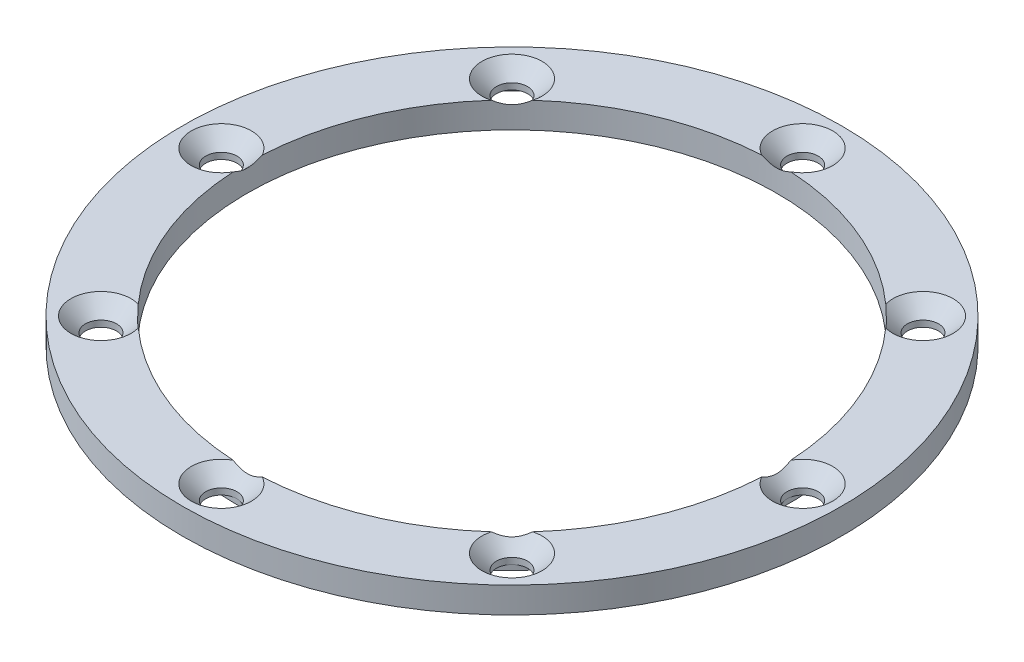
ISO-10303-21;
HEADER;
FILE_DESCRIPTION(('STEP AP214'),'2;1');
FILE_NAME('part.step','',(''),(''),'','','');
FILE_SCHEMA(('AUTOMOTIVE_DESIGN { 1 0 10303 214 1 1 1 1 }'));
ENDSEC;
DATA;
#1=APPLICATION_CONTEXT('core data for automotive mechanical design processes');
#2=APPLICATION_PROTOCOL_DEFINITION('international standard','automotive_design',2000,#1);
#3=PRODUCT_CONTEXT('',#1,'mechanical');
#4=PRODUCT('Part','Part','',(#3));
#5=PRODUCT_RELATED_PRODUCT_CATEGORY('part','',(#4));
#6=PRODUCT_DEFINITION_FORMATION('','',#4);
#7=PRODUCT_DEFINITION_CONTEXT('part definition',#1,'design');
#8=PRODUCT_DEFINITION('design','',#6,#7);
#9=PRODUCT_DEFINITION_SHAPE('','',#8);
#10=(LENGTH_UNIT() NAMED_UNIT(*) SI_UNIT(.MILLI.,.METRE.));
#11=(NAMED_UNIT(*) PLANE_ANGLE_UNIT() SI_UNIT($,.RADIAN.));
#12=(NAMED_UNIT(*) SI_UNIT($,.STERADIAN.) SOLID_ANGLE_UNIT());
#13=UNCERTAINTY_MEASURE_WITH_UNIT(LENGTH_MEASURE(1.E-05),#10,'distance_accuracy_value','');
#14=(GEOMETRIC_REPRESENTATION_CONTEXT(3) GLOBAL_UNCERTAINTY_ASSIGNED_CONTEXT((#13)) GLOBAL_UNIT_ASSIGNED_CONTEXT((#10,
#11,#12)) REPRESENTATION_CONTEXT('',''));
#15=CARTESIAN_POINT('',(0.,0.,0.));
#16=DIRECTION('',(0.,0.,1.));
#17=DIRECTION('',(1.,0.,0.));
#18=AXIS2_PLACEMENT_3D('',#15,#16,#17);
#19=CARTESIAN_POINT('',(0.,0.,0.));
#20=DIRECTION('',(0.,1.,0.));
#21=DIRECTION('',(0.,0.,1.));
#22=AXIS2_PLACEMENT_3D('',#19,#20,#21);
#23=PLANE('',#22);
#24=CARTESIAN_POINT('',(0.,0.,0.));
#25=DIRECTION('',(0.,1.,0.));
#26=DIRECTION('',(0.,0.,1.));
#27=AXIS2_PLACEMENT_3D('',#24,#25,#26);
#28=CIRCLE('',#27,25.5);
#29=CARTESIAN_POINT('',(0.,0.,25.5));
#30=VERTEX_POINT('',#29);
#31=EDGE_CURVE('E153',#30,#30,#28,.T.);
#32=ORIENTED_EDGE('',*,*,#31,.T.);
#33=EDGE_LOOP('',(#32));
#34=FACE_BOUND('',#33,.T.);
#35=CARTESIAN_POINT('',(0.,0.,0.));
#36=DIRECTION('',(0.,-1.,0.));
#37=DIRECTION('',(0.,0.,-1.));
#38=AXIS2_PLACEMENT_3D('',#35,#36,#37);
#39=CIRCLE('',#38,26.5);
#40=CARTESIAN_POINT('',(0.,0.,-26.5));
#41=VERTEX_POINT('',#40);
#42=EDGE_CURVE('E271',#41,#41,#39,.T.);
#43=ORIENTED_EDGE('',*,*,#42,.T.);
#44=EDGE_LOOP('',(#43));
#45=FACE_BOUND('',#44,.T.);
#46=ADVANCED_FACE('F34',(#34,#45),#23,.F.);
#47=CARTESIAN_POINT('',(19.7989898732233,10.,-19.7989898732233));
#48=DIRECTION('',(0.,-1.,0.));
#49=DIRECTION('',(0.,0.,-1.));
#50=AXIS2_PLACEMENT_3D('',#47,#48,#49);
#51=CYLINDRICAL_SURFACE('',#50,1.5);
#52=CARTESIAN_POINT('',(19.7989898732233,1.1,-19.7989898732233));
#53=DIRECTION('',(0.,1.,0.));
#54=DIRECTION('',(0.,0.,1.));
#55=AXIS2_PLACEMENT_3D('',#52,#53,#54);
#56=CIRCLE('',#55,1.5);
#57=CARTESIAN_POINT('',(19.7989898732233,1.1,-18.2989898732233));
#58=VERTEX_POINT('',#57);
#59=EDGE_CURVE('E239',#58,#58,#56,.T.);
#60=ORIENTED_EDGE('',*,*,#59,.T.);
#61=EDGE_LOOP('',(#60));
#62=FACE_BOUND('',#61,.T.);
#63=CARTESIAN_POINT('',(19.7989898732233,0.5,-19.7989898732233));
#64=DIRECTION('',(0.,-1.,0.));
#65=DIRECTION('',(0.,0.,-1.));
#66=AXIS2_PLACEMENT_3D('',#63,#64,#65);
#67=CIRCLE('',#66,1.5);
#68=CARTESIAN_POINT('',(18.7383297014435,0.5,-18.7383297014435));
#69=VERTEX_POINT('',#68);
#70=EDGE_CURVE('E151',#69,#69,#67,.F.);
#71=ORIENTED_EDGE('',*,*,#70,.F.);
#72=EDGE_LOOP('',(#71));
#73=FACE_BOUND('',#72,.T.);
#74=ADVANCED_FACE('F227',(#62,#73),#51,.F.);
#75=CARTESIAN_POINT('',(28.,10.,0.));
#76=DIRECTION('',(0.,-1.,0.));
#77=DIRECTION('',(0.,0.,-1.));
#78=AXIS2_PLACEMENT_3D('',#75,#76,#77);
#79=CYLINDRICAL_SURFACE('',#78,1.5);
#80=CARTESIAN_POINT('',(28.,1.1,0.));
#81=DIRECTION('',(0.,1.,0.));
#82=DIRECTION('',(0.,0.,1.));
#83=AXIS2_PLACEMENT_3D('',#80,#81,#82);
#84=CIRCLE('',#83,1.5);
#85=CARTESIAN_POINT('',(28.,1.1,1.5));
#86=VERTEX_POINT('',#85);
#87=EDGE_CURVE('E302',#86,#86,#84,.T.);
#88=ORIENTED_EDGE('',*,*,#87,.T.);
#89=EDGE_LOOP('',(#88));
#90=FACE_BOUND('',#89,.T.);
#91=CARTESIAN_POINT('',(28.,0.5,0.));
#92=DIRECTION('',(0.,-1.,0.));
#93=DIRECTION('',(0.,0.,-1.));
#94=AXIS2_PLACEMENT_3D('',#91,#92,#93);
#95=CIRCLE('',#94,1.5);
#96=CARTESIAN_POINT('',(26.5,0.5,0.));
#97=VERTEX_POINT('',#96);
#98=EDGE_CURVE('E244',#97,#97,#95,.F.);
#99=ORIENTED_EDGE('',*,*,#98,.F.);
#100=EDGE_LOOP('',(#99));
#101=FACE_BOUND('',#100,.T.);
#102=ADVANCED_FACE('F224',(#90,#101),#79,.F.);
#103=CARTESIAN_POINT('',(19.7989898732233,10.,19.7989898732233));
#104=DIRECTION('',(0.,-1.,0.));
#105=DIRECTION('',(0.,0.,-1.));
#106=AXIS2_PLACEMENT_3D('',#103,#104,#105);
#107=CYLINDRICAL_SURFACE('',#106,1.5);
#108=CARTESIAN_POINT('',(19.7989898732233,1.1,19.7989898732233));
#109=DIRECTION('',(0.,1.,0.));
#110=DIRECTION('',(0.,0.,1.));
#111=AXIS2_PLACEMENT_3D('',#108,#109,#110);
#112=CIRCLE('',#111,1.5);
#113=CARTESIAN_POINT('',(19.7989898732233,1.1,21.2989898732233));
#114=VERTEX_POINT('',#113);
#115=EDGE_CURVE('E297',#114,#114,#112,.T.);
#116=ORIENTED_EDGE('',*,*,#115,.T.);
#117=EDGE_LOOP('',(#116));
#118=FACE_BOUND('',#117,.T.);
#119=CARTESIAN_POINT('',(19.7989898732233,0.5,19.7989898732233));
#120=DIRECTION('',(0.,-1.,0.));
#121=DIRECTION('',(0.,0.,-1.));
#122=AXIS2_PLACEMENT_3D('',#119,#120,#121);
#123=CIRCLE('',#122,1.5);
#124=CARTESIAN_POINT('',(18.7383297014435,0.5,18.7383297014435));
#125=VERTEX_POINT('',#124);
#126=EDGE_CURVE('E246',#125,#125,#123,.F.);
#127=ORIENTED_EDGE('',*,*,#126,.F.);
#128=EDGE_LOOP('',(#127));
#129=FACE_BOUND('',#128,.T.);
#130=ADVANCED_FACE('F220',(#118,#129),#107,.F.);
#131=CARTESIAN_POINT('',(0.,10.,28.));
#132=DIRECTION('',(0.,-1.,0.));
#133=DIRECTION('',(0.,0.,-1.));
#134=AXIS2_PLACEMENT_3D('',#131,#132,#133);
#135=CYLINDRICAL_SURFACE('',#134,1.5);
#136=CARTESIAN_POINT('',(0.,1.1,28.));
#137=DIRECTION('',(0.,1.,0.));
#138=DIRECTION('',(0.,0.,1.));
#139=AXIS2_PLACEMENT_3D('',#136,#137,#138);
#140=CIRCLE('',#139,1.5);
#141=CARTESIAN_POINT('',(0.,1.1,29.5));
#142=VERTEX_POINT('',#141);
#143=EDGE_CURVE('E292',#142,#142,#140,.T.);
#144=ORIENTED_EDGE('',*,*,#143,.T.);
#145=EDGE_LOOP('',(#144));
#146=FACE_BOUND('',#145,.T.);
#147=CARTESIAN_POINT('',(0.,0.5,28.));
#148=DIRECTION('',(0.,-1.,0.));
#149=DIRECTION('',(0.,0.,-1.));
#150=AXIS2_PLACEMENT_3D('',#147,#148,#149);
#151=CIRCLE('',#150,1.5);
#152=CARTESIAN_POINT('',(0.,0.5,26.5));
#153=VERTEX_POINT('',#152);
#154=EDGE_CURVE('E250',#153,#153,#151,.F.);
#155=ORIENTED_EDGE('',*,*,#154,.F.);
#156=EDGE_LOOP('',(#155));
#157=FACE_BOUND('',#156,.T.);
#158=ADVANCED_FACE('F216',(#146,#157),#135,.F.);
#159=CARTESIAN_POINT('',(-19.7989898732233,10.,19.7989898732233));
#160=DIRECTION('',(0.,-1.,0.));
#161=DIRECTION('',(0.,0.,-1.));
#162=AXIS2_PLACEMENT_3D('',#159,#160,#161);
#163=CYLINDRICAL_SURFACE('',#162,1.5);
#164=CARTESIAN_POINT('',(-19.7989898732233,1.1,19.7989898732233));
#165=DIRECTION('',(0.,1.,0.));
#166=DIRECTION('',(0.,0.,1.));
#167=AXIS2_PLACEMENT_3D('',#164,#165,#166);
#168=CIRCLE('',#167,1.5);
#169=CARTESIAN_POINT('',(-19.7989898732233,1.1,21.2989898732233));
#170=VERTEX_POINT('',#169);
#171=EDGE_CURVE('E275',#170,#170,#168,.T.);
#172=ORIENTED_EDGE('',*,*,#171,.T.);
#173=EDGE_LOOP('',(#172));
#174=FACE_BOUND('',#173,.T.);
#175=CARTESIAN_POINT('',(-19.7989898732233,0.5,19.7989898732233));
#176=DIRECTION('',(0.,-1.,0.));
#177=DIRECTION('',(0.,0.,-1.));
#178=AXIS2_PLACEMENT_3D('',#175,#176,#177);
#179=CIRCLE('',#178,1.5);
#180=CARTESIAN_POINT('',(-18.7383297014435,0.5,18.7383297014435));
#181=VERTEX_POINT('',#180);
#182=EDGE_CURVE('E255',#181,#181,#179,.F.);
#183=ORIENTED_EDGE('',*,*,#182,.F.);
#184=EDGE_LOOP('',(#183));
#185=FACE_BOUND('',#184,.T.);
#186=ADVANCED_FACE('F212',(#174,#185),#163,.F.);
#187=CARTESIAN_POINT('',(-28.,10.,0.));
#188=DIRECTION('',(0.,-1.,0.));
#189=DIRECTION('',(0.,0.,-1.));
#190=AXIS2_PLACEMENT_3D('',#187,#188,#189);
#191=CYLINDRICAL_SURFACE('',#190,1.4999999999999);
#192=CARTESIAN_POINT('',(-28.,1.1,0.));
#193=DIRECTION('',(0.,1.,0.));
#194=DIRECTION('',(0.,0.,1.));
#195=AXIS2_PLACEMENT_3D('',#192,#193,#194);
#196=CIRCLE('',#195,1.5);
#197=CARTESIAN_POINT('',(-28.,1.1,1.5));
#198=VERTEX_POINT('',#197);
#199=EDGE_CURVE('E287',#198,#198,#196,.T.);
#200=ORIENTED_EDGE('',*,*,#199,.T.);
#201=EDGE_LOOP('',(#200));
#202=FACE_BOUND('',#201,.T.);
#203=CARTESIAN_POINT('',(-28.,0.5,0.));
#204=DIRECTION('',(0.,-1.,0.));
#205=DIRECTION('',(0.,0.,-1.));
#206=AXIS2_PLACEMENT_3D('',#203,#204,#205);
#207=CIRCLE('',#206,1.4999999999999);
#208=CARTESIAN_POINT('',(-26.5,0.5,0.));
#209=VERTEX_POINT('',#208);
#210=EDGE_CURVE('E258',#209,#209,#207,.F.);
#211=ORIENTED_EDGE('',*,*,#210,.F.);
#212=EDGE_LOOP('',(#211));
#213=FACE_BOUND('',#212,.T.);
#214=ADVANCED_FACE('F208',(#202,#213),#191,.F.);
#215=CARTESIAN_POINT('',(-19.7989898732233,10.,-19.7989898732233));
#216=DIRECTION('',(0.,-1.,0.));
#217=DIRECTION('',(0.,0.,-1.));
#218=AXIS2_PLACEMENT_3D('',#215,#216,#217);
#219=CYLINDRICAL_SURFACE('',#218,1.5);
#220=CARTESIAN_POINT('',(-19.7989898732233,1.1,-19.7989898732233));
#221=DIRECTION('',(0.,1.,0.));
#222=DIRECTION('',(0.,0.,1.));
#223=AXIS2_PLACEMENT_3D('',#220,#221,#222);
#224=CIRCLE('',#223,1.5);
#225=CARTESIAN_POINT('',(-19.7989898732233,1.1,-18.2989898732233));
#226=VERTEX_POINT('',#225);
#227=EDGE_CURVE('E282',#226,#226,#224,.T.);
#228=ORIENTED_EDGE('',*,*,#227,.T.);
#229=EDGE_LOOP('',(#228));
#230=FACE_BOUND('',#229,.T.);
#231=CARTESIAN_POINT('',(-19.7989898732233,0.5,-19.7989898732233));
#232=DIRECTION('',(0.,-1.,0.));
#233=DIRECTION('',(0.,0.,-1.));
#234=AXIS2_PLACEMENT_3D('',#231,#232,#233);
#235=CIRCLE('',#234,1.5);
#236=CARTESIAN_POINT('',(-18.7383297014435,0.5,-18.7383297014435));
#237=VERTEX_POINT('',#236);
#238=EDGE_CURVE('E261',#237,#237,#235,.F.);
#239=ORIENTED_EDGE('',*,*,#238,.F.);
#240=EDGE_LOOP('',(#239));
#241=FACE_BOUND('',#240,.T.);
#242=ADVANCED_FACE('F204',(#230,#241),#219,.F.);
#243=CARTESIAN_POINT('',(0.,10.,-28.));
#244=DIRECTION('',(0.,-1.,0.));
#245=DIRECTION('',(0.,0.,-1.));
#246=AXIS2_PLACEMENT_3D('',#243,#244,#245);
#247=CYLINDRICAL_SURFACE('',#246,1.5);
#248=CARTESIAN_POINT('',(0.,1.1,-28.));
#249=DIRECTION('',(0.,1.,0.));
#250=DIRECTION('',(0.,0.,1.));
#251=AXIS2_PLACEMENT_3D('',#248,#249,#250);
#252=CIRCLE('',#251,1.5);
#253=CARTESIAN_POINT('',(0.,1.1,-26.5));
#254=VERTEX_POINT('',#253);
#255=EDGE_CURVE('E136',#254,#254,#252,.T.);
#256=ORIENTED_EDGE('',*,*,#255,.T.);
#257=EDGE_LOOP('',(#256));
#258=FACE_BOUND('',#257,.T.);
#259=CARTESIAN_POINT('',(0.,0.5,-28.));
#260=DIRECTION('',(0.,-1.,0.));
#261=DIRECTION('',(0.,0.,-1.));
#262=AXIS2_PLACEMENT_3D('',#259,#260,#261);
#263=CIRCLE('',#262,1.5);
#264=CARTESIAN_POINT('',(0.,0.5,-26.5));
#265=VERTEX_POINT('',#264);
#266=EDGE_CURVE('E160',#265,#265,#263,.F.);
#267=ORIENTED_EDGE('',*,*,#266,.F.);
#268=EDGE_LOOP('',(#267));
#269=FACE_BOUND('',#268,.T.);
#270=ADVANCED_FACE('F201',(#258,#269),#247,.F.);
#271=CARTESIAN_POINT('',(0.,2.5,0.));
#272=DIRECTION('',(0.,1.,0.));
#273=DIRECTION('',(0.,0.,1.));
#274=AXIS2_PLACEMENT_3D('',#271,#272,#273);
#275=PLANE('',#274);
#276=CARTESIAN_POINT('',(0.,2.5,-28.));
#277=DIRECTION('',(0.,1.,0.));
#278=DIRECTION('',(0.,0.,1.));
#279=AXIS2_PLACEMENT_3D('',#276,#277,#278);
#280=CIRCLE('',#279,2.9);
#281=CARTESIAN_POINT('',(1.40201822457513,2.5,-25.4614285714286));
#282=VERTEX_POINT('',#281);
#283=CARTESIAN_POINT('',(-1.40201822457513,2.5,-25.4614285714286));
#284=VERTEX_POINT('',#283);
#285=EDGE_CURVE('E52',#282,#284,#280,.T.);
#286=ORIENTED_EDGE('',*,*,#285,.F.);
#287=CARTESIAN_POINT('',(0.,2.5,0.));
#288=DIRECTION('',(0.,1.,0.));
#289=DIRECTION('',(0.,0.,1.));
#290=AXIS2_PLACEMENT_3D('',#287,#288,#289);
#291=CIRCLE('',#290,25.5);
#292=CARTESIAN_POINT('',(17.0125722076099,2.5,-18.9953253954982));
#293=VERTEX_POINT('',#292);
#294=EDGE_CURVE('E133',#293,#282,#291,.T.);
#295=ORIENTED_EDGE('',*,*,#294,.F.);
#296=CARTESIAN_POINT('',(19.7989898732233,2.5,-19.7989898732233));
#297=DIRECTION('',(0.,1.,0.));
#298=DIRECTION('',(0.,0.,1.));
#299=AXIS2_PLACEMENT_3D('',#296,#297,#298);
#300=CIRCLE('',#299,2.9);
#301=CARTESIAN_POINT('',(18.9953253954983,2.5,-17.0125722076098));
#302=VERTEX_POINT('',#301);
#303=EDGE_CURVE('E59',#302,#293,#300,.T.);
#304=ORIENTED_EDGE('',*,*,#303,.F.);
#305=CARTESIAN_POINT('',(25.4614285714286,2.5,-1.40201822457513));
#306=VERTEX_POINT('',#305);
#307=EDGE_CURVE('E141',#306,#302,#291,.T.);
#308=ORIENTED_EDGE('',*,*,#307,.F.);
#309=CARTESIAN_POINT('',(28.,2.5,0.));
#310=DIRECTION('',(0.,1.,0.));
#311=DIRECTION('',(0.,0.,1.));
#312=AXIS2_PLACEMENT_3D('',#309,#310,#311);
#313=CIRCLE('',#312,2.9);
#314=CARTESIAN_POINT('',(25.4614285714286,2.5,1.40201822457514));
#315=VERTEX_POINT('',#314);
#316=EDGE_CURVE('E305',#315,#306,#313,.T.);
#317=ORIENTED_EDGE('',*,*,#316,.F.);
#318=CARTESIAN_POINT('',(18.9953253954982,2.5,17.0125722076099));
#319=VERTEX_POINT('',#318);
#320=EDGE_CURVE('E143',#319,#315,#291,.T.);
#321=ORIENTED_EDGE('',*,*,#320,.F.);
#322=CARTESIAN_POINT('',(19.7989898732233,2.5,19.7989898732233));
#323=DIRECTION('',(0.,1.,0.));
#324=DIRECTION('',(0.,0.,1.));
#325=AXIS2_PLACEMENT_3D('',#322,#323,#324);
#326=CIRCLE('',#325,2.9);
#327=CARTESIAN_POINT('',(17.0125722076099,2.5,18.9953253954982));
#328=VERTEX_POINT('',#327);
#329=EDGE_CURVE('E300',#328,#319,#326,.T.);
#330=ORIENTED_EDGE('',*,*,#329,.F.);
#331=CARTESIAN_POINT('',(1.40201822457513,2.5,25.4614285714286));
#332=VERTEX_POINT('',#331);
#333=EDGE_CURVE('E150',#332,#328,#291,.T.);
#334=ORIENTED_EDGE('',*,*,#333,.F.);
#335=CARTESIAN_POINT('',(0.,2.5,28.));
#336=DIRECTION('',(0.,1.,0.));
#337=DIRECTION('',(0.,0.,1.));
#338=AXIS2_PLACEMENT_3D('',#335,#336,#337);
#339=CIRCLE('',#338,2.9);
#340=CARTESIAN_POINT('',(-1.4020182245751,2.5,25.4614285714286));
#341=VERTEX_POINT('',#340);
#342=EDGE_CURVE('E295',#341,#332,#339,.T.);
#343=ORIENTED_EDGE('',*,*,#342,.F.);
#344=CARTESIAN_POINT('',(-17.0125722076099,2.5,18.9953253954982));
#345=VERTEX_POINT('',#344);
#346=EDGE_CURVE('E145',#345,#341,#291,.T.);
#347=ORIENTED_EDGE('',*,*,#346,.F.);
#348=CARTESIAN_POINT('',(-19.7989898732233,2.5,19.7989898732233));
#349=DIRECTION('',(0.,1.,0.));
#350=DIRECTION('',(0.,0.,1.));
#351=AXIS2_PLACEMENT_3D('',#348,#349,#350);
#352=CIRCLE('',#351,2.9);
#353=CARTESIAN_POINT('',(-18.9953253954982,2.5,17.0125722076099));
#354=VERTEX_POINT('',#353);
#355=EDGE_CURVE('E280',#354,#345,#352,.T.);
#356=ORIENTED_EDGE('',*,*,#355,.F.);
#357=CARTESIAN_POINT('',(-25.4614285714286,2.5,1.40201822457513));
#358=VERTEX_POINT('',#357);
#359=EDGE_CURVE('E156',#358,#354,#291,.T.);
#360=ORIENTED_EDGE('',*,*,#359,.F.);
#361=CARTESIAN_POINT('',(-28.,2.5,0.));
#362=DIRECTION('',(0.,1.,0.));
#363=DIRECTION('',(0.,0.,1.));
#364=AXIS2_PLACEMENT_3D('',#361,#362,#363);
#365=CIRCLE('',#364,2.9);
#366=CARTESIAN_POINT('',(-25.4614285714286,2.5,-1.4020182245751));
#367=VERTEX_POINT('',#366);
#368=EDGE_CURVE('E290',#367,#358,#365,.T.);
#369=ORIENTED_EDGE('',*,*,#368,.F.);
#370=CARTESIAN_POINT('',(-18.9953253954982,2.5,-17.0125722076099));
#371=VERTEX_POINT('',#370);
#372=EDGE_CURVE('E144',#371,#367,#291,.T.);
#373=ORIENTED_EDGE('',*,*,#372,.F.);
#374=CARTESIAN_POINT('',(-19.7989898732233,2.5,-19.7989898732233));
#375=DIRECTION('',(0.,1.,0.));
#376=DIRECTION('',(0.,0.,1.));
#377=AXIS2_PLACEMENT_3D('',#374,#375,#376);
#378=CIRCLE('',#377,2.9);
#379=CARTESIAN_POINT('',(-17.0125722076099,2.5,-18.9953253954982));
#380=VERTEX_POINT('',#379);
#381=EDGE_CURVE('E285',#380,#371,#378,.T.);
#382=ORIENTED_EDGE('',*,*,#381,.F.);
#383=EDGE_CURVE('E135',#284,#380,#291,.T.);
#384=ORIENTED_EDGE('',*,*,#383,.F.);
#385=EDGE_LOOP('',(#286,#295,#304,#308,#317,#321,#330,#334,#343,#347,#356,#360,#369,#373,#382,#384));
#386=FACE_BOUND('',#385,.T.);
#387=CARTESIAN_POINT('',(0.,2.5,0.));
#388=DIRECTION('',(0.,1.,0.));
#389=DIRECTION('',(0.,0.,1.));
#390=AXIS2_PLACEMENT_3D('',#387,#388,#389);
#391=CIRCLE('',#390,31.75);
#392=CARTESIAN_POINT('',(0.,2.5,31.75));
#393=VERTEX_POINT('',#392);
#394=EDGE_CURVE('E157',#393,#393,#391,.T.);
#395=ORIENTED_EDGE('',*,*,#394,.T.);
#396=EDGE_LOOP('',(#395));
#397=FACE_BOUND('',#396,.T.);
#398=ADVANCED_FACE('F131',(#386,#397),#275,.T.);
#399=CARTESIAN_POINT('',(0.,0.,0.));
#400=DIRECTION('',(0.,-1.,0.));
#401=DIRECTION('',(0.,0.,-1.));
#402=AXIS2_PLACEMENT_3D('',#399,#400,#401);
#403=CIRCLE('',#402,30.1);
#404=CARTESIAN_POINT('',(0.,0.,-30.1));
#405=VERTEX_POINT('',#404);
#406=EDGE_CURVE('E265',#405,#405,#403,.T.);
#407=ORIENTED_EDGE('',*,*,#406,.F.);
#408=EDGE_LOOP('',(#407));
#409=FACE_BOUND('',#408,.T.);
#410=CARTESIAN_POINT('',(0.,0.,0.));
#411=DIRECTION('',(0.,1.,0.));
#412=DIRECTION('',(0.,0.,1.));
#413=AXIS2_PLACEMENT_3D('',#410,#411,#412);
#414=CIRCLE('',#413,31.75);
#415=CARTESIAN_POINT('',(0.,0.,31.75));
#416=VERTEX_POINT('',#415);
#417=EDGE_CURVE('E149',#416,#416,#414,.T.);
#418=ORIENTED_EDGE('',*,*,#417,.F.);
#419=EDGE_LOOP('',(#418));
#420=FACE_BOUND('',#419,.T.);
#421=ADVANCED_FACE('F235',(#409,#420),#23,.F.);
#422=CARTESIAN_POINT('',(0.,2.5,0.));
#423=DIRECTION('',(0.,-1.,0.));
#424=DIRECTION('',(0.,0.,-1.));
#425=AXIS2_PLACEMENT_3D('',#422,#423,#424);
#426=CYLINDRICAL_SURFACE('',#425,31.75);
#427=ORIENTED_EDGE('',*,*,#394,.F.);
#428=EDGE_LOOP('',(#427));
#429=FACE_BOUND('',#428,.T.);
#430=ORIENTED_EDGE('',*,*,#417,.T.);
#431=EDGE_LOOP('',(#430));
#432=FACE_BOUND('',#431,.T.);
#433=ADVANCED_FACE('F36',(#429,#432),#426,.T.);
#434=CARTESIAN_POINT('',(0.,2.5,0.));
#435=DIRECTION('',(0.,-1.,0.));
#436=DIRECTION('',(0.,0.,-1.));
#437=AXIS2_PLACEMENT_3D('',#434,#435,#436);
#438=CYLINDRICAL_SURFACE('',#437,25.5);
#439=CARTESIAN_POINT('',(-1.40239436985385,2.50020000000007,-25.4614078564286));
#440=CARTESIAN_POINT('',(-1.3118366687618,2.45209759930701,-25.4663939558961));
#441=CARTESIAN_POINT('',(-1.2197228584569,2.40654212439101,-25.470984498099));
#442=CARTESIAN_POINT('',(-1.03171050973899,2.3223475934979,-25.4792956622875));
#443=CARTESIAN_POINT('',(-0.935792589611791,2.28375164662999,-25.4830109031364));
#444=CARTESIAN_POINT('',(-0.741986203090166,2.21641346393442,-25.4893841822287));
#445=CARTESIAN_POINT('',(-0.644145904203591,2.18753751884072,-25.4920566541333));
#446=CARTESIAN_POINT('',(-0.445929747226496,2.14129375767504,-25.4962923608107));
#447=CARTESIAN_POINT('',(-0.345561008351081,2.12389671876225,-25.4978584130172));
#448=CARTESIAN_POINT('',(-0.17502296034384,2.10566776214397,-25.499494249546));
#449=CARTESIAN_POINT('',(-0.105219371718194,2.10135792741152,-25.4998787051824));
#450=CARTESIAN_POINT('',(0.0345161764189417,2.09919094651754,-25.5000722855377));
#451=CARTESIAN_POINT('',(0.104448165821366,2.10133556570077,-25.4998812528559));
#452=CARTESIAN_POINT('',(0.243881150736247,2.1119697587486,-25.4989291910815));
#453=CARTESIAN_POINT('',(0.313381676779155,2.12046532363216,-25.4981676237866));
#454=CARTESIAN_POINT('',(0.451377437259453,2.14335057747516,-25.4960981665694));
#455=CARTESIAN_POINT('',(0.519872739925218,2.15773986447057,-25.4947903139047));
#456=CARTESIAN_POINT('',(0.658845670277138,2.19257881603634,-25.49158663268));
#457=CARTESIAN_POINT('',(0.729256216134126,2.21329065283314,-25.4896651569482));
#458=CARTESIAN_POINT('',(0.868450664642345,2.25962285102817,-25.4853025500202));
#459=CARTESIAN_POINT('',(0.93723364454418,2.28524592533187,-25.482861131531));
#460=CARTESIAN_POINT('',(1.07306880660454,2.34054880394141,-25.4775027216841));
#461=CARTESIAN_POINT('',(1.14012184800241,2.37022654636,-25.4745859718982));
#462=CARTESIAN_POINT('',(1.27249951518899,2.43289602233266,-25.4683159694716));
#463=CARTESIAN_POINT('',(1.33782701354401,2.46588174357752,-25.4649635055792));
#464=CARTESIAN_POINT('',(1.40239436985372,2.5002,-25.4614078564286));
#465=B_SPLINE_CURVE_WITH_KNOTS('',3,(#439,#440,#441,#442,#443,#444,#445,#446,#447,#448,#449,
#450,#451,#452,#453,#454,#455,#456,#457,#458,#459,#460,#461,#462,#463,#464),.UNSPECIFIED.,.F.,
.F.,(4,2,2,2,2,2,2,2,2,2,2,2,4),(0.,0.308186105249208,0.618220112972473,0.923796046504019,
1.22859101634992,1.43812437114333,1.64771504019287,1.85750367167649,2.06727799752388,
2.28732054891554,2.50748500116183,2.72753790883044,2.94719787567289),.UNSPECIFIED.);
#466=EDGE_CURVE('E11',#284,#282,#465,.T.);
#467=ORIENTED_EDGE('',*,*,#466,.F.);
#468=ORIENTED_EDGE('',*,*,#383,.T.);
#469=CARTESIAN_POINT('',(-18.9955767226585,2.5002,-17.0122915850157));
#470=CARTESIAN_POINT('',(-18.9350684628728,2.45209759930695,-17.0798512542917));
#471=CARTESIAN_POINT('',(-18.8731801664863,2.40654212439096,-17.1482315577202));
#472=CARTESIAN_POINT('',(-18.7461122403183,2.32234759349786,-17.2870532450027));
#473=CARTESIAN_POINT('',(-18.680915100557,2.28375164662995,-17.3575045287599));
#474=CARTESIAN_POINT('',(-18.5483798792749,2.2164134639344,-17.4990529277712));
#475=CARTESIAN_POINT('',(-18.4810860634651,2.18753751884071,-17.5701261895935));
#476=CARTESIAN_POINT('',(-18.3439211716407,2.14129375767503,-17.7132812752474));
#477=CARTESIAN_POINT('',(-18.2740571218976,2.12389671876224,-17.7853600572602));
#478=CARTESIAN_POINT('',(-18.1546252228038,2.10566776214396,-17.9071053785589));
#479=CARTESIAN_POINT('',(-18.105538483123,2.10135792741152,-17.9567358206148));
#480=CARTESIAN_POINT('',(-18.0068674114444,2.09919094651754,-18.0556806562573));
#481=CARTESIAN_POINT('',(-17.9572829470113,2.10133556570077,-18.1049949596809));
#482=CARTESIAN_POINT('',(-17.8580157285201,2.1119697587486,-18.2029157594985));
#483=CARTESIAN_POINT('',(-17.8083329258606,2.12046532363217,-18.251521543361));
#484=CARTESIAN_POINT('',(-17.7092918606183,2.14335057747517,-18.3476359541399));
#485=CARTESIAN_POINT('',(-17.659933576136,2.15773986447058,-18.3951446556463));
#486=CARTESIAN_POINT('',(-17.5593995299639,2.19257881603637,-18.4911480123808));
#487=CARTESIAN_POINT('',(-17.5082530670015,2.2132906528332,-18.5395770983036));
#488=CARTESIAN_POINT('',(-17.4067428996153,2.25962285102831,-18.634917607805));
#489=CARTESIAN_POINT('',(-17.356379644527,2.28524592533206,-18.6818281757544));
#490=CARTESIAN_POINT('',(-17.2565407123712,2.3405488039417,-18.7740891720318));
#491=CARTESIAN_POINT('',(-17.2070645985469,2.37022654636035,-18.8194403787509));
#492=CARTESIAN_POINT('',(-17.1090258911676,2.43289602233312,-18.9086119636624));
#493=CARTESIAN_POINT('',(-17.0604618241307,2.46588174357804,-18.9524349307952));
#494=CARTESIAN_POINT('',(-17.0122915850148,2.50020000000059,-18.9955767226592));
#495=B_SPLINE_CURVE_WITH_KNOTS('',3,(#469,#470,#471,#472,#473,#474,#475,#476,#477,#478,#479,
#480,#481,#482,#483,#484,#485,#486,#487,#488,#489,#490,#491,#492,#493,#494),.UNSPECIFIED.,.F.,
.F.,(4,2,2,2,2,2,2,2,2,2,2,2,4),(0.,0.308186105249181,0.618220112972424,0.923796046503937,
1.2285910163498,1.43812437114321,1.64771504019274,1.85750367167637,2.06727799752375,
2.28732054891572,2.50748500116232,2.72753790883124,2.94719787567401),.UNSPECIFIED.);
#496=EDGE_CURVE('E172',#371,#380,#495,.T.);
#497=ORIENTED_EDGE('',*,*,#496,.F.);
#498=ORIENTED_EDGE('',*,*,#372,.T.);
#499=CARTESIAN_POINT('',(-25.4614078564286,2.5002,1.40239436985372));
#500=CARTESIAN_POINT('',(-25.4663939558961,2.45209759930694,1.31183666876167));
#501=CARTESIAN_POINT('',(-25.470984498099,2.40654212439095,1.21972285845678));
#502=CARTESIAN_POINT('',(-25.4792956622875,2.32234759349786,1.03171050973889));
#503=CARTESIAN_POINT('',(-25.4830109031364,2.28375164662995,0.935792589611695));
#504=CARTESIAN_POINT('',(-25.4893841822287,2.2164134639344,0.741986203090088));
#505=CARTESIAN_POINT('',(-25.4920566541333,2.18753751884071,0.644145904203522));
#506=CARTESIAN_POINT('',(-25.4962923608107,2.14129375767503,0.445929747226447));
#507=CARTESIAN_POINT('',(-25.4978584130172,2.12389671876225,0.345561008351041));
#508=CARTESIAN_POINT('',(-25.499494249546,2.10566776214396,0.17502296034381));
#509=CARTESIAN_POINT('',(-25.4998787051824,2.10135792741152,0.105219371718164));
#510=CARTESIAN_POINT('',(-25.5000722855377,2.09919094651754,-0.0345161764189705));
#511=CARTESIAN_POINT('',(-25.4998812528559,2.10133556570077,-0.104448165821394));
#512=CARTESIAN_POINT('',(-25.4989291910815,2.1119697587486,-0.243881150736274));
#513=CARTESIAN_POINT('',(-25.4981676237866,2.12046532363216,-0.313381676779182));
#514=CARTESIAN_POINT('',(-25.4960981665694,2.14335057747517,-0.451377437259479));
#515=CARTESIAN_POINT('',(-25.4947903139047,2.15773986447058,-0.519872739925244));
#516=CARTESIAN_POINT('',(-25.49158663268,2.19257881603635,-0.658845670277174));
#517=CARTESIAN_POINT('',(-25.4896651569482,2.21329065283315,-0.729256216134171));
#518=CARTESIAN_POINT('',(-25.4853025500202,2.25962285102819,-0.868450664642409));
#519=CARTESIAN_POINT('',(-25.482861131531,2.2852459253319,-0.937233644544254));
#520=CARTESIAN_POINT('',(-25.4775027216841,2.34054880394144,-1.07306880660463));
#521=CARTESIAN_POINT('',(-25.4745859718982,2.37022654636004,-1.14012184800251));
#522=CARTESIAN_POINT('',(-25.4683159694716,2.43289602233271,-1.27249951518911));
#523=CARTESIAN_POINT('',(-25.4649635055792,2.46588174357758,-1.33782701354414));
#524=CARTESIAN_POINT('',(-25.4614078564286,2.50020000000007,-1.40239436985386));
#525=B_SPLINE_CURVE_WITH_KNOTS('',3,(#499,#500,#501,#502,#503,#504,#505,#506,#507,#508,#509,
#510,#511,#512,#513,#514,#515,#516,#517,#518,#519,#520,#521,#522,#523,#524),.UNSPECIFIED.,.F.,
.F.,(4,2,2,2,2,2,2,2,2,2,2,2,4),(0.,0.308186105249177,0.61822011297241,0.923796046503925,
1.2285910163498,1.43812437114321,1.64771504019274,1.85750367167637,2.06727799752375,
2.28732054891544,2.50748500116176,2.72753790883041,2.94719787567289),.UNSPECIFIED.);
#526=EDGE_CURVE('E355',#358,#367,#525,.T.);
#527=ORIENTED_EDGE('',*,*,#526,.F.);
#528=ORIENTED_EDGE('',*,*,#359,.T.);
#529=CARTESIAN_POINT('',(-17.0122915850149,2.50020000000059,18.9955767226592));
#530=CARTESIAN_POINT('',(-17.0798512542909,2.45209759930747,18.9350684628735));
#531=CARTESIAN_POINT('',(-17.1482315577195,2.40654212439142,18.8731801664869));
#532=CARTESIAN_POINT('',(-17.287053245002,2.32234759349821,18.7461122403188));
#533=CARTESIAN_POINT('',(-17.3575045287593,2.28375164663025,18.6809151005575));
#534=CARTESIAN_POINT('',(-17.4990529277708,2.21641346393459,18.5483798792753));
#535=CARTESIAN_POINT('',(-17.5701261895931,2.18753751884086,18.4810860634655));
#536=CARTESIAN_POINT('',(-17.7132812752471,2.1412937576751,18.3439211716409));
#537=CARTESIAN_POINT('',(-17.78536005726,2.12389671876229,18.2740571218978));
#538=CARTESIAN_POINT('',(-17.9071053785587,2.10566776214398,18.1546252228039));
#539=CARTESIAN_POINT('',(-17.9567358206147,2.10135792741153,18.1055384831232));
#540=CARTESIAN_POINT('',(-18.0556806562572,2.09919094651754,18.0068674114445));
#541=CARTESIAN_POINT('',(-18.1049949596808,2.10133556570076,17.9572829470115));
#542=CARTESIAN_POINT('',(-18.2029157594984,2.11196975874858,17.8580157285203));
#543=CARTESIAN_POINT('',(-18.2515215433608,2.12046532363214,17.8083329258608));
#544=CARTESIAN_POINT('',(-18.3476359541398,2.14335057747513,17.7092918606185));
#545=CARTESIAN_POINT('',(-18.3951446556462,2.15773986447054,17.6599335761361));
#546=CARTESIAN_POINT('',(-18.4911480123807,2.1925788160363,17.5593995299641));
#547=CARTESIAN_POINT('',(-18.5395770983034,2.2132906528331,17.5082530670018));
#548=CARTESIAN_POINT('',(-18.6349176078046,2.25962285102813,17.4067428996156));
#549=CARTESIAN_POINT('',(-18.681828175754,2.28524592533183,17.3563796445274));
#550=CARTESIAN_POINT('',(-18.7740891720313,2.34054880394138,17.2565407123718));
#551=CARTESIAN_POINT('',(-18.8194403787504,2.37022654635998,17.2070645985475));
#552=CARTESIAN_POINT('',(-18.9086119636617,2.43289602233265,17.1090258911683));
#553=CARTESIAN_POINT('',(-18.9524349307945,2.46588174357751,17.0604618241315));
#554=CARTESIAN_POINT('',(-18.9955767226585,2.5002,17.0122915850157));
#555=B_SPLINE_CURVE_WITH_KNOTS('',3,(#529,#530,#531,#532,#533,#534,#535,#536,#537,#538,#539,
#540,#541,#542,#543,#544,#545,#546,#547,#548,#549,#550,#551,#552,#553,#554),.UNSPECIFIED.,.F.,
.F.,(4,2,2,2,2,2,2,2,2,2,2,2,4),(0.,0.308186105249435,0.618220112972937,0.923796046504709,
1.22859101635083,1.43812437114425,1.6477150401938,1.85750367167743,2.06727799752483,
2.28732054891653,2.50748500116286,2.72753790883151,2.94719787567401),.UNSPECIFIED.);
#556=EDGE_CURVE('E165',#345,#354,#555,.T.);
#557=ORIENTED_EDGE('',*,*,#556,.F.);
#558=ORIENTED_EDGE('',*,*,#346,.T.);
#559=CARTESIAN_POINT('',(1.40239436985371,2.5002,25.4614078564286));
#560=CARTESIAN_POINT('',(1.31183666876167,2.45209759930694,25.4663939558961));
#561=CARTESIAN_POINT('',(1.21972285845677,2.40654212439095,25.470984498099));
#562=CARTESIAN_POINT('',(1.03171050973888,2.32234759349786,25.4792956622875));
#563=CARTESIAN_POINT('',(0.935792589611693,2.28375164662995,25.4830109031364));
#564=CARTESIAN_POINT('',(0.741986203090086,2.2164134639344,25.4893841822287));
#565=CARTESIAN_POINT('',(0.644145904203521,2.18753751884071,25.4920566541333));
#566=CARTESIAN_POINT('',(0.445929747226446,2.14129375767503,25.4962923608107));
#567=CARTESIAN_POINT('',(0.345561008351041,2.12389671876225,25.4978584130172));
#568=CARTESIAN_POINT('',(0.17502296034381,2.10566776214396,25.499494249546));
#569=CARTESIAN_POINT('',(0.105219371718165,2.10135792741152,25.4998787051824));
#570=CARTESIAN_POINT('',(-0.0345161764189694,2.09919094651754,25.5000722855377));
#571=CARTESIAN_POINT('',(-0.104448165821393,2.10133556570077,25.4998812528559));
#572=CARTESIAN_POINT('',(-0.243881150736272,2.1119697587486,25.4989291910815));
#573=CARTESIAN_POINT('',(-0.31338167677918,2.12046532363217,25.4981676237866));
#574=CARTESIAN_POINT('',(-0.451377437259477,2.14335057747517,25.4960981665694));
#575=CARTESIAN_POINT('',(-0.519872739925242,2.15773986447058,25.4947903139047));
#576=CARTESIAN_POINT('',(-0.658845670277173,2.19257881603635,25.49158663268));
#577=CARTESIAN_POINT('',(-0.72925621613417,2.21329065283315,25.4896651569482));
#578=CARTESIAN_POINT('',(-0.868450664642409,2.25962285102819,25.4853025500202));
#579=CARTESIAN_POINT('',(-0.937233644544254,2.28524592533189,25.482861131531));
#580=CARTESIAN_POINT('',(-1.07306880660463,2.34054880394144,25.4775027216841));
#581=CARTESIAN_POINT('',(-1.14012184800251,2.37022654636004,25.4745859718982));
#582=CARTESIAN_POINT('',(-1.27249951518911,2.43289602233271,25.4683159694716));
#583=CARTESIAN_POINT('',(-1.33782701354415,2.46588174357758,25.4649635055792));
#584=CARTESIAN_POINT('',(-1.40239436985386,2.50020000000007,25.4614078564286));
#585=B_SPLINE_CURVE_WITH_KNOTS('',3,(#559,#560,#561,#562,#563,#564,#565,#566,#567,#568,#569,
#570,#571,#572,#573,#574,#575,#576,#577,#578,#579,#580,#581,#582,#583,#584),.UNSPECIFIED.,.F.,
.F.,(4,2,2,2,2,2,2,2,2,2,2,2,4),(0.,0.308186105249177,0.618220112972411,0.923796046503924,
1.2285910163498,1.4381243711432,1.64771504019274,1.85750367167636,2.06727799752375,
2.28732054891544,2.50748500116176,2.7275379088304,2.94719787567289),.UNSPECIFIED.);
#586=EDGE_CURVE('E338',#332,#341,#585,.T.);
#587=ORIENTED_EDGE('',*,*,#586,.F.);
#588=ORIENTED_EDGE('',*,*,#333,.T.);
#589=CARTESIAN_POINT('',(18.9955767226585,2.50020000000001,17.0122915850157));
#590=CARTESIAN_POINT('',(18.9350684628728,2.45209759930695,17.0798512542917));
#591=CARTESIAN_POINT('',(18.8731801664863,2.40654212439096,17.1482315577202));
#592=CARTESIAN_POINT('',(18.7461122403183,2.32234759349786,17.2870532450027));
#593=CARTESIAN_POINT('',(18.680915100557,2.28375164662996,17.3575045287599));
#594=CARTESIAN_POINT('',(18.5483798792749,2.21641346393441,17.4990529277712));
#595=CARTESIAN_POINT('',(18.4810860634652,2.18753751884071,17.5701261895935));
#596=CARTESIAN_POINT('',(18.3439211716407,2.14129375767504,17.7132812752474));
#597=CARTESIAN_POINT('',(18.2740571218976,2.12389671876225,17.7853600572602));
#598=CARTESIAN_POINT('',(18.1546252228038,2.10566776214397,17.9071053785589));
#599=CARTESIAN_POINT('',(18.105538483123,2.10135792741153,17.9567358206148));
#600=CARTESIAN_POINT('',(18.0068674114444,2.09919094651754,18.0556806562573));
#601=CARTESIAN_POINT('',(17.9572829470113,2.10133556570077,18.1049949596809));
#602=CARTESIAN_POINT('',(17.8580157285201,2.1119697587486,18.2029157594985));
#603=CARTESIAN_POINT('',(17.8083329258606,2.12046532363217,18.251521543361));
#604=CARTESIAN_POINT('',(17.7092918606183,2.14335057747517,18.3476359541399));
#605=CARTESIAN_POINT('',(17.659933576136,2.15773986447058,18.3951446556463));
#606=CARTESIAN_POINT('',(17.5593995299639,2.19257881603637,18.4911480123808));
#607=CARTESIAN_POINT('',(17.5082530670015,2.2132906528332,18.5395770983036));
#608=CARTESIAN_POINT('',(17.4067428996153,2.25962285102831,18.634917607805));
#609=CARTESIAN_POINT('',(17.356379644527,2.28524592533206,18.6818281757544));
#610=CARTESIAN_POINT('',(17.2565407123712,2.3405488039417,18.7740891720318));
#611=CARTESIAN_POINT('',(17.2070645985469,2.37022654636035,18.8194403787509));
#612=CARTESIAN_POINT('',(17.1090258911676,2.43289602233312,18.9086119636624));
#613=CARTESIAN_POINT('',(17.0604618241307,2.46588174357804,18.9524349307952));
#614=CARTESIAN_POINT('',(17.0122915850148,2.50020000000059,18.9955767226592));
#615=B_SPLINE_CURVE_WITH_KNOTS('',3,(#589,#590,#591,#592,#593,#594,#595,#596,#597,#598,#599,
#600,#601,#602,#603,#604,#605,#606,#607,#608,#609,#610,#611,#612,#613,#614),.UNSPECIFIED.,.F.,
.F.,(4,2,2,2,2,2,2,2,2,2,2,2,4),(0.,0.308186105249179,0.618220112972419,0.923796046503935,
1.22859101634981,1.43812437114321,1.64771504019274,1.85750367167637,2.06727799752375,
2.28732054891572,2.50748500116232,2.72753790883125,2.94719787567401),.UNSPECIFIED.);
#616=EDGE_CURVE('E333',#319,#328,#615,.T.);
#617=ORIENTED_EDGE('',*,*,#616,.F.);
#618=ORIENTED_EDGE('',*,*,#320,.T.);
#619=CARTESIAN_POINT('',(25.4614078564286,2.50020000000007,-1.40239436985385));
#620=CARTESIAN_POINT('',(25.4663939558961,2.45209759930701,-1.31183666876179));
#621=CARTESIAN_POINT('',(25.470984498099,2.40654212439101,-1.21972285845689));
#622=CARTESIAN_POINT('',(25.4792956622875,2.3223475934979,-1.03171050973898));
#623=CARTESIAN_POINT('',(25.4830109031364,2.28375164662999,-0.935792589611785));
#624=CARTESIAN_POINT('',(25.4893841822287,2.21641346393442,-0.74198620309016));
#625=CARTESIAN_POINT('',(25.4920566541333,2.18753751884073,-0.644145904203585));
#626=CARTESIAN_POINT('',(25.4962923608107,2.14129375767504,-0.44592974722649));
#627=CARTESIAN_POINT('',(25.4978584130172,2.12389671876225,-0.345561008351075));
#628=CARTESIAN_POINT('',(25.499494249546,2.10566776214397,-0.175022960343832));
#629=CARTESIAN_POINT('',(25.4998787051824,2.10135792741152,-0.105219371718186));
#630=CARTESIAN_POINT('',(25.5000722855377,2.09919094651754,0.0345161764189492));
#631=CARTESIAN_POINT('',(25.4998812528559,2.10133556570077,0.104448165821373));
#632=CARTESIAN_POINT('',(25.4989291910815,2.1119697587486,0.243881150736254));
#633=CARTESIAN_POINT('',(25.4981676237866,2.12046532363216,0.313381676779162));
#634=CARTESIAN_POINT('',(25.4960981665694,2.14335057747516,0.451377437259461));
#635=CARTESIAN_POINT('',(25.4947903139047,2.15773986447057,0.519872739925226));
#636=CARTESIAN_POINT('',(25.49158663268,2.19257881603634,0.658845670277146));
#637=CARTESIAN_POINT('',(25.4896651569482,2.21329065283314,0.729256216134133));
#638=CARTESIAN_POINT('',(25.4853025500202,2.25962285102817,0.868450664642351));
#639=CARTESIAN_POINT('',(25.482861131531,2.28524592533187,0.937233644544186));
#640=CARTESIAN_POINT('',(25.4775027216841,2.34054880394141,1.07306880660455));
#641=CARTESIAN_POINT('',(25.4745859718982,2.37022654636,1.14012184800241));
#642=CARTESIAN_POINT('',(25.4683159694716,2.43289602233266,1.27249951518899));
#643=CARTESIAN_POINT('',(25.4649635055792,2.46588174357751,1.33782701354402));
#644=CARTESIAN_POINT('',(25.4614078564286,2.5002,1.40239436985372));
#645=B_SPLINE_CURVE_WITH_KNOTS('',3,(#619,#620,#621,#622,#623,#624,#625,#626,#627,#628,#629,
#630,#631,#632,#633,#634,#635,#636,#637,#638,#639,#640,#641,#642,#643,#644),.UNSPECIFIED.,.F.,
.F.,(4,2,2,2,2,2,2,2,2,2,2,2,4),(0.,0.308186105249208,0.618220112972473,0.923796046504019,
1.22859101634992,1.43812437114333,1.64771504019287,1.8575036716765,2.06727799752388,
2.28732054891554,2.50748500116183,2.72753790883044,2.94719787567289),.UNSPECIFIED.);
#646=EDGE_CURVE('E328',#306,#315,#645,.T.);
#647=ORIENTED_EDGE('',*,*,#646,.F.);
#648=ORIENTED_EDGE('',*,*,#307,.T.);
#649=CARTESIAN_POINT('',(17.0122915850149,2.50020000000059,-18.9955767226592));
#650=CARTESIAN_POINT('',(17.0798512542909,2.45209759930748,-18.9350684628735));
#651=CARTESIAN_POINT('',(17.1482315577195,2.40654212439143,-18.8731801664869));
#652=CARTESIAN_POINT('',(17.287053245002,2.32234759349821,-18.7461122403188));
#653=CARTESIAN_POINT('',(17.3575045287593,2.28375164663024,-18.6809151005575));
#654=CARTESIAN_POINT('',(17.4990529277708,2.21641346393459,-18.5483798792753));
#655=CARTESIAN_POINT('',(17.5701261895931,2.18753751884085,-18.4810860634655));
#656=CARTESIAN_POINT('',(17.7132812752471,2.14129375767511,-18.3439211716409));
#657=CARTESIAN_POINT('',(17.78536005726,2.12389671876229,-18.2740571218978));
#658=CARTESIAN_POINT('',(17.9071053785587,2.10566776214398,-18.1546252228039));
#659=CARTESIAN_POINT('',(17.9567358206147,2.10135792741153,-18.1055384831232));
#660=CARTESIAN_POINT('',(18.0556806562572,2.09919094651753,-18.0068674114445));
#661=CARTESIAN_POINT('',(18.1049949596808,2.10133556570076,-17.9572829470115));
#662=CARTESIAN_POINT('',(18.2029157594984,2.11196975874858,-17.8580157285203));
#663=CARTESIAN_POINT('',(18.2515215433608,2.12046532363214,-17.8083329258608));
#664=CARTESIAN_POINT('',(18.3476359541398,2.14335057747513,-17.7092918606185));
#665=CARTESIAN_POINT('',(18.3951446556462,2.15773986447054,-17.6599335761361));
#666=CARTESIAN_POINT('',(18.4911480123807,2.1925788160363,-17.5593995299641));
#667=CARTESIAN_POINT('',(18.5395770983034,2.2132906528331,-17.5082530670018));
#668=CARTESIAN_POINT('',(18.6349176078046,2.25962285102813,-17.4067428996156));
#669=CARTESIAN_POINT('',(18.681828175754,2.28524592533184,-17.3563796445274));
#670=CARTESIAN_POINT('',(18.7740891720313,2.34054880394139,-17.2565407123717));
#671=CARTESIAN_POINT('',(18.8194403787504,2.37022654635998,-17.2070645985475));
#672=CARTESIAN_POINT('',(18.9086119636617,2.43289602233265,-17.1090258911683));
#673=CARTESIAN_POINT('',(18.9524349307945,2.46588174357752,-17.0604618241315));
#674=CARTESIAN_POINT('',(18.9955767226585,2.50020000000001,-17.0122915850157));
#675=B_SPLINE_CURVE_WITH_KNOTS('',3,(#649,#650,#651,#652,#653,#654,#655,#656,#657,#658,#659,
#660,#661,#662,#663,#664,#665,#666,#667,#668,#669,#670,#671,#672,#673,#674),.UNSPECIFIED.,.F.,
.F.,(4,2,2,2,2,2,2,2,2,2,2,2,4),(0.,0.308186105249439,0.618220112972935,0.923796046504707,
1.22859101635083,1.43812437114426,1.6477150401938,1.85750367167743,2.06727799752482,
2.28732054891653,2.50748500116286,2.72753790883152,2.94719787567402),.UNSPECIFIED.);
#676=EDGE_CURVE('E47',#293,#302,#675,.T.);
#677=ORIENTED_EDGE('',*,*,#676,.F.);
#678=ORIENTED_EDGE('',*,*,#294,.T.);
#679=EDGE_LOOP('',(#467,#468,#497,#498,#527,#528,#557,#558,#587,#588,#617,#618,#647,#648,#677,#678));
#680=FACE_BOUND('',#679,.T.);
#681=ORIENTED_EDGE('',*,*,#31,.F.);
#682=EDGE_LOOP('',(#681));
#683=FACE_BOUND('',#682,.T.);
#684=ADVANCED_FACE('F138',(#680,#683),#438,.F.);
#685=CARTESIAN_POINT('',(0.,0.5,0.));
#686=DIRECTION('',(0.,-1.,0.));
#687=DIRECTION('',(0.,0.,-1.));
#688=AXIS2_PLACEMENT_3D('',#685,#686,#687);
#689=PLANE('',#688);
#690=CARTESIAN_POINT('',(0.,0.5,0.));
#691=DIRECTION('',(0.,-1.,0.));
#692=DIRECTION('',(0.,0.,-1.));
#693=AXIS2_PLACEMENT_3D('',#690,#691,#692);
#694=CIRCLE('',#693,30.1);
#695=CARTESIAN_POINT('',(0.,0.5,-30.1));
#696=VERTEX_POINT('',#695);
#697=EDGE_CURVE('E264',#696,#696,#694,.T.);
#698=ORIENTED_EDGE('',*,*,#697,.T.);
#699=EDGE_LOOP('',(#698));
#700=FACE_BOUND('',#699,.T.);
#701=CARTESIAN_POINT('',(0.,0.5,0.));
#702=DIRECTION('',(0.,-1.,0.));
#703=DIRECTION('',(0.,0.,-1.));
#704=AXIS2_PLACEMENT_3D('',#701,#702,#703);
#705=CIRCLE('',#704,26.5);
#706=EDGE_CURVE('E268',#265,#69,#705,.T.);
#707=ORIENTED_EDGE('',*,*,#706,.F.);
#708=ORIENTED_EDGE('',*,*,#266,.T.);
#709=EDGE_CURVE('E274',#237,#265,#705,.T.);
#710=ORIENTED_EDGE('',*,*,#709,.F.);
#711=ORIENTED_EDGE('',*,*,#238,.T.);
#712=EDGE_CURVE('E550',#209,#237,#705,.T.);
#713=ORIENTED_EDGE('',*,*,#712,.F.);
#714=ORIENTED_EDGE('',*,*,#210,.T.);
#715=EDGE_CURVE('E548',#181,#209,#705,.T.);
#716=ORIENTED_EDGE('',*,*,#715,.F.);
#717=ORIENTED_EDGE('',*,*,#182,.T.);
#718=EDGE_CURVE('E547',#153,#181,#705,.T.);
#719=ORIENTED_EDGE('',*,*,#718,.F.);
#720=ORIENTED_EDGE('',*,*,#154,.T.);
#721=EDGE_CURVE('E544',#125,#153,#705,.T.);
#722=ORIENTED_EDGE('',*,*,#721,.F.);
#723=ORIENTED_EDGE('',*,*,#126,.T.);
#724=EDGE_CURVE('E543',#97,#125,#705,.T.);
#725=ORIENTED_EDGE('',*,*,#724,.F.);
#726=ORIENTED_EDGE('',*,*,#98,.T.);
#727=EDGE_CURVE('E277',#69,#97,#705,.T.);
#728=ORIENTED_EDGE('',*,*,#727,.F.);
#729=ORIENTED_EDGE('',*,*,#70,.T.);
#730=EDGE_LOOP('',(#707,#708,#710,#711,#713,#714,#716,#717,#719,#720,#722,#723,#725,#726,#728,#729));
#731=FACE_BOUND('',#730,.T.);
#732=ADVANCED_FACE('F193',(#700,#731),#689,.T.);
#733=CARTESIAN_POINT('',(0.,0.5,0.));
#734=DIRECTION('',(0.,-1.,0.));
#735=DIRECTION('',(0.,0.,-1.));
#736=AXIS2_PLACEMENT_3D('',#733,#734,#735);
#737=CYLINDRICAL_SURFACE('',#736,26.5);
#738=ORIENTED_EDGE('',*,*,#709,.T.);
#739=ORIENTED_EDGE('',*,*,#706,.T.);
#740=ORIENTED_EDGE('',*,*,#727,.T.);
#741=ORIENTED_EDGE('',*,*,#724,.T.);
#742=ORIENTED_EDGE('',*,*,#721,.T.);
#743=ORIENTED_EDGE('',*,*,#718,.T.);
#744=ORIENTED_EDGE('',*,*,#715,.T.);
#745=ORIENTED_EDGE('',*,*,#712,.T.);
#746=EDGE_LOOP('',(#738,#739,#740,#741,#742,#743,#744,#745));
#747=FACE_BOUND('',#746,.T.);
#748=ORIENTED_EDGE('',*,*,#42,.F.);
#749=EDGE_LOOP('',(#748));
#750=FACE_BOUND('',#749,.T.);
#751=ADVANCED_FACE('F190',(#747,#750),#737,.T.);
#752=CARTESIAN_POINT('',(0.,0.5,0.));
#753=DIRECTION('',(0.,-1.,0.));
#754=DIRECTION('',(0.,0.,-1.));
#755=AXIS2_PLACEMENT_3D('',#752,#753,#754);
#756=CYLINDRICAL_SURFACE('',#755,30.1);
#757=ORIENTED_EDGE('',*,*,#697,.F.);
#758=EDGE_LOOP('',(#757));
#759=FACE_BOUND('',#758,.T.);
#760=ORIENTED_EDGE('',*,*,#406,.T.);
#761=EDGE_LOOP('',(#760));
#762=FACE_BOUND('',#761,.T.);
#763=ADVANCED_FACE('F186',(#759,#762),#756,.F.);
#764=CARTESIAN_POINT('',(-19.7989898732233,2.5,19.7989898732233));
#765=DIRECTION('',(0.,1.,0.));
#766=DIRECTION('',(0.,0.,1.));
#767=AXIS2_PLACEMENT_3D('',#764,#765,#766);
#768=CONICAL_SURFACE('',#767,2.9,0.785398163397449);
#769=ORIENTED_EDGE('',*,*,#556,.T.);
#770=ORIENTED_EDGE('',*,*,#355,.T.);
#771=EDGE_LOOP('',(#769,#770));
#772=FACE_BOUND('',#771,.T.);
#773=ORIENTED_EDGE('',*,*,#171,.F.);
#774=EDGE_LOOP('',(#773));
#775=FACE_BOUND('',#774,.T.);
#776=ADVANCED_FACE('F181',(#772,#775),#768,.F.);
#777=CARTESIAN_POINT('',(-19.7989898732233,2.5,-19.7989898732233));
#778=DIRECTION('',(0.,1.,0.));
#779=DIRECTION('',(0.,0.,1.));
#780=AXIS2_PLACEMENT_3D('',#777,#778,#779);
#781=CONICAL_SURFACE('',#780,2.9,0.785398163397448);
#782=ORIENTED_EDGE('',*,*,#496,.T.);
#783=ORIENTED_EDGE('',*,*,#381,.T.);
#784=EDGE_LOOP('',(#782,#783));
#785=FACE_BOUND('',#784,.T.);
#786=ORIENTED_EDGE('',*,*,#227,.F.);
#787=EDGE_LOOP('',(#786));
#788=FACE_BOUND('',#787,.T.);
#789=ADVANCED_FACE('F185',(#785,#788),#781,.F.);
#790=CARTESIAN_POINT('',(-28.,2.5,0.));
#791=DIRECTION('',(0.,1.,0.));
#792=DIRECTION('',(0.,0.,1.));
#793=AXIS2_PLACEMENT_3D('',#790,#791,#792);
#794=CONICAL_SURFACE('',#793,2.9,0.785398163397449);
#795=ORIENTED_EDGE('',*,*,#526,.T.);
#796=ORIENTED_EDGE('',*,*,#368,.T.);
#797=EDGE_LOOP('',(#795,#796));
#798=FACE_BOUND('',#797,.T.);
#799=ORIENTED_EDGE('',*,*,#199,.F.);
#800=EDGE_LOOP('',(#799));
#801=FACE_BOUND('',#800,.T.);
#802=ADVANCED_FACE('F350',(#798,#801),#794,.F.);
#803=CARTESIAN_POINT('',(0.,2.5,28.));
#804=DIRECTION('',(0.,1.,0.));
#805=DIRECTION('',(0.,0.,1.));
#806=AXIS2_PLACEMENT_3D('',#803,#804,#805);
#807=CONICAL_SURFACE('',#806,2.9,0.785398163397448);
#808=ORIENTED_EDGE('',*,*,#586,.T.);
#809=ORIENTED_EDGE('',*,*,#342,.T.);
#810=EDGE_LOOP('',(#808,#809));
#811=FACE_BOUND('',#810,.T.);
#812=ORIENTED_EDGE('',*,*,#143,.F.);
#813=EDGE_LOOP('',(#812));
#814=FACE_BOUND('',#813,.T.);
#815=ADVANCED_FACE('F346',(#811,#814),#807,.F.);
#816=CARTESIAN_POINT('',(19.7989898732233,2.5,19.7989898732233));
#817=DIRECTION('',(0.,1.,0.));
#818=DIRECTION('',(0.,0.,1.));
#819=AXIS2_PLACEMENT_3D('',#816,#817,#818);
#820=CONICAL_SURFACE('',#819,2.9,0.785398163397448);
#821=ORIENTED_EDGE('',*,*,#616,.T.);
#822=ORIENTED_EDGE('',*,*,#329,.T.);
#823=EDGE_LOOP('',(#821,#822));
#824=FACE_BOUND('',#823,.T.);
#825=ORIENTED_EDGE('',*,*,#115,.F.);
#826=EDGE_LOOP('',(#825));
#827=FACE_BOUND('',#826,.T.);
#828=ADVANCED_FACE('F343',(#824,#827),#820,.F.);
#829=CARTESIAN_POINT('',(28.,2.5,0.));
#830=DIRECTION('',(0.,1.,0.));
#831=DIRECTION('',(0.,0.,1.));
#832=AXIS2_PLACEMENT_3D('',#829,#830,#831);
#833=CONICAL_SURFACE('',#832,2.9,0.785398163397449);
#834=ORIENTED_EDGE('',*,*,#646,.T.);
#835=ORIENTED_EDGE('',*,*,#316,.T.);
#836=EDGE_LOOP('',(#834,#835));
#837=FACE_BOUND('',#836,.T.);
#838=ORIENTED_EDGE('',*,*,#87,.F.);
#839=EDGE_LOOP('',(#838));
#840=FACE_BOUND('',#839,.T.);
#841=ADVANCED_FACE('F317',(#837,#840),#833,.F.);
#842=CARTESIAN_POINT('',(19.7989898732233,2.5,-19.7989898732233));
#843=DIRECTION('',(0.,1.,0.));
#844=DIRECTION('',(0.,0.,1.));
#845=AXIS2_PLACEMENT_3D('',#842,#843,#844);
#846=CONICAL_SURFACE('',#845,2.9,0.785398163397448);
#847=ORIENTED_EDGE('',*,*,#676,.T.);
#848=ORIENTED_EDGE('',*,*,#303,.T.);
#849=EDGE_LOOP('',(#847,#848));
#850=FACE_BOUND('',#849,.T.);
#851=ORIENTED_EDGE('',*,*,#59,.F.);
#852=EDGE_LOOP('',(#851));
#853=FACE_BOUND('',#852,.T.);
#854=ADVANCED_FACE('F313',(#850,#853),#846,.F.);
#855=CARTESIAN_POINT('',(0.,2.5,-28.));
#856=DIRECTION('',(0.,1.,0.));
#857=DIRECTION('',(0.,0.,1.));
#858=AXIS2_PLACEMENT_3D('',#855,#856,#857);
#859=CONICAL_SURFACE('',#858,2.9,0.785398163397448);
#860=ORIENTED_EDGE('',*,*,#466,.T.);
#861=ORIENTED_EDGE('',*,*,#285,.T.);
#862=EDGE_LOOP('',(#860,#861));
#863=FACE_BOUND('',#862,.T.);
#864=ORIENTED_EDGE('',*,*,#255,.F.);
#865=EDGE_LOOP('',(#864));
#866=FACE_BOUND('',#865,.T.);
#867=ADVANCED_FACE('F124',(#863,#866),#859,.F.);
#868=CLOSED_SHELL('',(#46,#74,#102,#130,#158,#186,#214,#242,#270,#398,#421,#433,#684,#732,#751,
#763,#776,#789,#802,#815,#828,#841,#854,#867));
#869=MANIFOLD_SOLID_BREP('B2',#868);
#870=ADVANCED_BREP_SHAPE_REPRESENTATION('',(#18,#869),#14);
#871=SHAPE_DEFINITION_REPRESENTATION(#9,#870);
ENDSEC;
END-ISO-10303-21;
